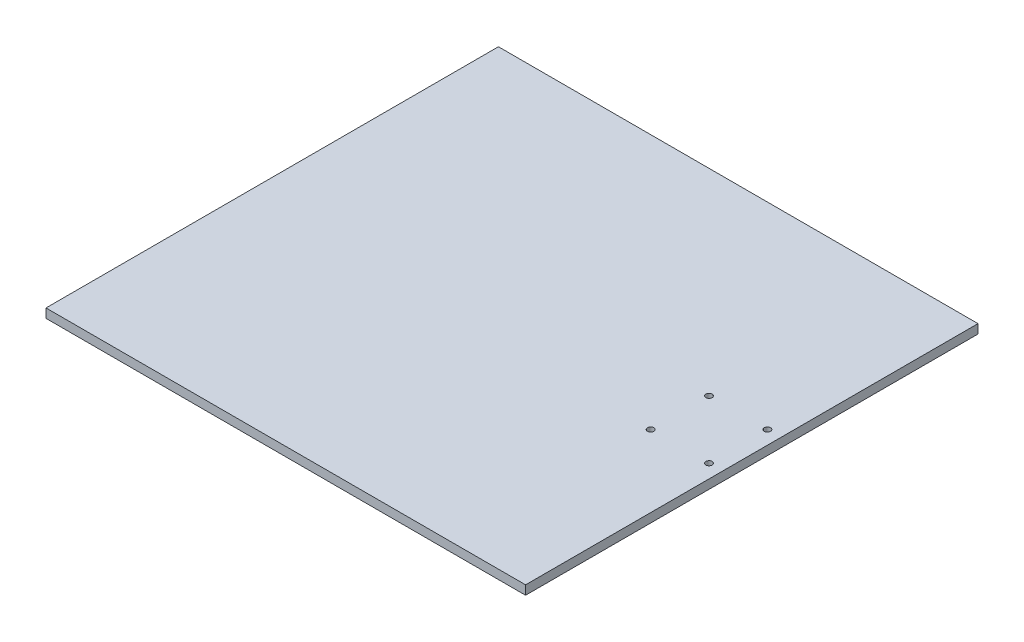
ISO-10303-21;
HEADER;
FILE_DESCRIPTION(('STEP AP214'),'2;1');
FILE_NAME('part.step','',(''),(''),'','','');
FILE_SCHEMA(('AUTOMOTIVE_DESIGN { 1 0 10303 214 1 1 1 1 }'));
ENDSEC;
DATA;
#1=APPLICATION_CONTEXT('core data for automotive mechanical design processes');
#2=APPLICATION_PROTOCOL_DEFINITION('international standard','automotive_design',2000,#1);
#3=PRODUCT_CONTEXT('',#1,'mechanical');
#4=PRODUCT('Part','Part','',(#3));
#5=PRODUCT_RELATED_PRODUCT_CATEGORY('part','',(#4));
#6=PRODUCT_DEFINITION_FORMATION('','',#4);
#7=PRODUCT_DEFINITION_CONTEXT('part definition',#1,'design');
#8=PRODUCT_DEFINITION('design','',#6,#7);
#9=PRODUCT_DEFINITION_SHAPE('','',#8);
#10=(LENGTH_UNIT() NAMED_UNIT(*) SI_UNIT(.MILLI.,.METRE.));
#11=(NAMED_UNIT(*) PLANE_ANGLE_UNIT() SI_UNIT($,.RADIAN.));
#12=(NAMED_UNIT(*) SI_UNIT($,.STERADIAN.) SOLID_ANGLE_UNIT());
#13=UNCERTAINTY_MEASURE_WITH_UNIT(LENGTH_MEASURE(1.E-05),#10,'distance_accuracy_value','');
#14=(GEOMETRIC_REPRESENTATION_CONTEXT(3) GLOBAL_UNCERTAINTY_ASSIGNED_CONTEXT((#13)) GLOBAL_UNIT_ASSIGNED_CONTEXT((#10,
#11,#12)) REPRESENTATION_CONTEXT('',''));
#15=CARTESIAN_POINT('',(0.,0.,0.));
#16=DIRECTION('',(0.,0.,1.));
#17=DIRECTION('',(1.,0.,0.));
#18=AXIS2_PLACEMENT_3D('',#15,#16,#17);
#19=CARTESIAN_POINT('',(265.,10.,250.));
#20=DIRECTION('',(-1.,0.,0.));
#21=DIRECTION('',(0.,0.,1.));
#22=AXIS2_PLACEMENT_3D('',#19,#20,#21);
#23=PLANE('',#22);
#24=DIRECTION('',(0.,0.,-1.));
#25=VECTOR('',#24,1.);
#26=CARTESIAN_POINT('',(265.,0.,250.));
#27=LINE('',#26,#25);
#28=CARTESIAN_POINT('',(265.,0.,250.));
#29=VERTEX_POINT('',#28);
#30=CARTESIAN_POINT('',(265.,0.,-250.));
#31=VERTEX_POINT('',#30);
#32=EDGE_CURVE('E96',#29,#31,#27,.T.);
#33=ORIENTED_EDGE('',*,*,#32,.T.);
#34=DIRECTION('',(0.,-1.,0.));
#35=VECTOR('',#34,1.);
#36=CARTESIAN_POINT('',(265.,10.,-250.));
#37=LINE('',#36,#35);
#38=CARTESIAN_POINT('',(265.,10.,-250.));
#39=VERTEX_POINT('',#38);
#40=EDGE_CURVE('E11',#39,#31,#37,.T.);
#41=ORIENTED_EDGE('',*,*,#40,.F.);
#42=DIRECTION('',(0.,0.,-1.));
#43=VECTOR('',#42,1.);
#44=CARTESIAN_POINT('',(265.,10.,250.));
#45=LINE('',#44,#43);
#46=CARTESIAN_POINT('',(265.,10.,250.));
#47=VERTEX_POINT('',#46);
#48=EDGE_CURVE('E84',#47,#39,#45,.T.);
#49=ORIENTED_EDGE('',*,*,#48,.F.);
#50=DIRECTION('',(0.,-1.,0.));
#51=VECTOR('',#50,1.);
#52=CARTESIAN_POINT('',(265.,10.,250.));
#53=LINE('',#52,#51);
#54=EDGE_CURVE('E92',#47,#29,#53,.T.);
#55=ORIENTED_EDGE('',*,*,#54,.T.);
#56=EDGE_LOOP('',(#33,#41,#49,#55));
#57=FACE_BOUND('',#56,.T.);
#58=ADVANCED_FACE('F33',(#57),#23,.F.);
#59=CARTESIAN_POINT('',(-265.,10.,-250.));
#60=DIRECTION('',(0.,0.,1.));
#61=DIRECTION('',(1.,0.,0.));
#62=AXIS2_PLACEMENT_3D('',#59,#60,#61);
#63=PLANE('',#62);
#64=DIRECTION('',(-1.,0.,0.));
#65=VECTOR('',#64,1.);
#66=CARTESIAN_POINT('',(-265.,0.,-250.));
#67=LINE('',#66,#65);
#68=CARTESIAN_POINT('',(-265.,0.,-250.));
#69=VERTEX_POINT('',#68);
#70=EDGE_CURVE('E88',#31,#69,#67,.T.);
#71=ORIENTED_EDGE('',*,*,#70,.T.);
#72=DIRECTION('',(0.,-1.,0.));
#73=VECTOR('',#72,1.);
#74=CARTESIAN_POINT('',(-265.,10.,-250.));
#75=LINE('',#74,#73);
#76=CARTESIAN_POINT('',(-265.,10.,-250.));
#77=VERTEX_POINT('',#76);
#78=EDGE_CURVE('E41',#77,#69,#75,.T.);
#79=ORIENTED_EDGE('',*,*,#78,.F.);
#80=DIRECTION('',(-1.,0.,0.));
#81=VECTOR('',#80,1.);
#82=CARTESIAN_POINT('',(-265.,10.,-250.));
#83=LINE('',#82,#81);
#84=EDGE_CURVE('E79',#39,#77,#83,.T.);
#85=ORIENTED_EDGE('',*,*,#84,.F.);
#86=ORIENTED_EDGE('',*,*,#40,.T.);
#87=EDGE_LOOP('',(#71,#79,#85,#86));
#88=FACE_BOUND('',#87,.T.);
#89=ADVANCED_FACE('F87',(#88),#63,.F.);
#90=CARTESIAN_POINT('',(-265.,10.,250.));
#91=DIRECTION('',(1.,0.,0.));
#92=DIRECTION('',(0.,0.,-1.));
#93=AXIS2_PLACEMENT_3D('',#90,#91,#92);
#94=PLANE('',#93);
#95=DIRECTION('',(0.,0.,1.));
#96=VECTOR('',#95,1.);
#97=CARTESIAN_POINT('',(-265.,0.,250.));
#98=LINE('',#97,#96);
#99=CARTESIAN_POINT('',(-265.,0.,250.));
#100=VERTEX_POINT('',#99);
#101=EDGE_CURVE('E66',#69,#100,#98,.T.);
#102=ORIENTED_EDGE('',*,*,#101,.T.);
#103=DIRECTION('',(0.,-1.,0.));
#104=VECTOR('',#103,1.);
#105=CARTESIAN_POINT('',(-265.,10.,250.));
#106=LINE('',#105,#104);
#107=CARTESIAN_POINT('',(-265.,10.,250.));
#108=VERTEX_POINT('',#107);
#109=EDGE_CURVE('E89',#108,#100,#106,.T.);
#110=ORIENTED_EDGE('',*,*,#109,.F.);
#111=DIRECTION('',(0.,0.,1.));
#112=VECTOR('',#111,1.);
#113=CARTESIAN_POINT('',(-265.,10.,250.));
#114=LINE('',#113,#112);
#115=EDGE_CURVE('E82',#77,#108,#114,.T.);
#116=ORIENTED_EDGE('',*,*,#115,.F.);
#117=ORIENTED_EDGE('',*,*,#78,.T.);
#118=EDGE_LOOP('',(#102,#110,#116,#117));
#119=FACE_BOUND('',#118,.T.);
#120=ADVANCED_FACE('F90',(#119),#94,.F.);
#121=CARTESIAN_POINT('',(-265.,10.,250.));
#122=DIRECTION('',(0.,0.,-1.));
#123=DIRECTION('',(-1.,0.,0.));
#124=AXIS2_PLACEMENT_3D('',#121,#122,#123);
#125=PLANE('',#124);
#126=DIRECTION('',(1.,0.,0.));
#127=VECTOR('',#126,1.);
#128=CARTESIAN_POINT('',(-265.,0.,250.));
#129=LINE('',#128,#127);
#130=EDGE_CURVE('E72',#100,#29,#129,.T.);
#131=ORIENTED_EDGE('',*,*,#130,.T.);
#132=ORIENTED_EDGE('',*,*,#54,.F.);
#133=DIRECTION('',(1.,0.,0.));
#134=VECTOR('',#133,1.);
#135=CARTESIAN_POINT('',(-265.,10.,250.));
#136=LINE('',#135,#134);
#137=EDGE_CURVE('E49',#108,#47,#136,.T.);
#138=ORIENTED_EDGE('',*,*,#137,.F.);
#139=ORIENTED_EDGE('',*,*,#109,.T.);
#140=EDGE_LOOP('',(#131,#132,#138,#139));
#141=FACE_BOUND('',#140,.T.);
#142=ADVANCED_FACE('F104',(#141),#125,.F.);
#143=CARTESIAN_POINT('',(0.,10.,0.));
#144=DIRECTION('',(0.,-1.,0.));
#145=DIRECTION('',(0.,0.,-1.));
#146=AXIS2_PLACEMENT_3D('',#143,#144,#145);
#147=PLANE('',#146);
#148=CARTESIAN_POINT('',(185.5,10.,32.25));
#149=DIRECTION('',(0.,1.,0.));
#150=DIRECTION('',(0.,0.,1.));
#151=AXIS2_PLACEMENT_3D('',#148,#149,#150);
#152=CIRCLE('',#151,3.49999999999999);
#153=CARTESIAN_POINT('',(185.5,10.,35.75));
#154=VERTEX_POINT('',#153);
#155=EDGE_CURVE('E128',#154,#154,#152,.T.);
#156=ORIENTED_EDGE('',*,*,#155,.F.);
#157=EDGE_LOOP('',(#156));
#158=FACE_BOUND('',#157,.T.);
#159=CARTESIAN_POINT('',(185.5,10.,-32.25));
#160=DIRECTION('',(0.,1.,0.));
#161=DIRECTION('',(0.,0.,1.));
#162=AXIS2_PLACEMENT_3D('',#159,#160,#161);
#163=CIRCLE('',#162,3.49999999999999);
#164=CARTESIAN_POINT('',(185.5,10.,-28.75));
#165=VERTEX_POINT('',#164);
#166=EDGE_CURVE('E122',#165,#165,#163,.T.);
#167=ORIENTED_EDGE('',*,*,#166,.F.);
#168=EDGE_LOOP('',(#167));
#169=FACE_BOUND('',#168,.T.);
#170=CARTESIAN_POINT('',(250.,10.,-32.25));
#171=DIRECTION('',(0.,1.,0.));
#172=DIRECTION('',(0.,0.,1.));
#173=AXIS2_PLACEMENT_3D('',#170,#171,#172);
#174=CIRCLE('',#173,3.50000000000002);
#175=CARTESIAN_POINT('',(250.,10.,-28.75));
#176=VERTEX_POINT('',#175);
#177=EDGE_CURVE('E116',#176,#176,#174,.T.);
#178=ORIENTED_EDGE('',*,*,#177,.F.);
#179=EDGE_LOOP('',(#178));
#180=FACE_BOUND('',#179,.T.);
#181=CARTESIAN_POINT('',(250.,10.,32.25));
#182=DIRECTION('',(0.,1.,0.));
#183=DIRECTION('',(0.,0.,1.));
#184=AXIS2_PLACEMENT_3D('',#181,#182,#183);
#185=CIRCLE('',#184,3.50000000000002);
#186=CARTESIAN_POINT('',(250.,10.,35.75));
#187=VERTEX_POINT('',#186);
#188=EDGE_CURVE('E110',#187,#187,#185,.T.);
#189=ORIENTED_EDGE('',*,*,#188,.F.);
#190=EDGE_LOOP('',(#189));
#191=FACE_BOUND('',#190,.T.);
#192=ORIENTED_EDGE('',*,*,#48,.T.);
#193=ORIENTED_EDGE('',*,*,#84,.T.);
#194=ORIENTED_EDGE('',*,*,#115,.T.);
#195=ORIENTED_EDGE('',*,*,#137,.T.);
#196=EDGE_LOOP('',(#192,#193,#194,#195));
#197=FACE_BOUND('',#196,.T.);
#198=ADVANCED_FACE('F80',(#158,#169,#180,#191,#197),#147,.F.);
#199=CARTESIAN_POINT('',(0.,0.,0.));
#200=DIRECTION('',(0.,-1.,0.));
#201=DIRECTION('',(0.,0.,-1.));
#202=AXIS2_PLACEMENT_3D('',#199,#200,#201);
#203=PLANE('',#202);
#204=CARTESIAN_POINT('',(185.5,0.,32.25));
#205=DIRECTION('',(0.,1.,0.));
#206=DIRECTION('',(0.,0.,1.));
#207=AXIS2_PLACEMENT_3D('',#204,#205,#206);
#208=CIRCLE('',#207,3.49999999999999);
#209=CARTESIAN_POINT('',(185.5,0.,35.75));
#210=VERTEX_POINT('',#209);
#211=EDGE_CURVE('E125',#210,#210,#208,.T.);
#212=ORIENTED_EDGE('',*,*,#211,.T.);
#213=EDGE_LOOP('',(#212));
#214=FACE_BOUND('',#213,.T.);
#215=CARTESIAN_POINT('',(185.5,0.,-32.25));
#216=DIRECTION('',(0.,1.,0.));
#217=DIRECTION('',(0.,0.,1.));
#218=AXIS2_PLACEMENT_3D('',#215,#216,#217);
#219=CIRCLE('',#218,3.49999999999999);
#220=CARTESIAN_POINT('',(185.5,0.,-28.75));
#221=VERTEX_POINT('',#220);
#222=EDGE_CURVE('E119',#221,#221,#219,.T.);
#223=ORIENTED_EDGE('',*,*,#222,.T.);
#224=EDGE_LOOP('',(#223));
#225=FACE_BOUND('',#224,.T.);
#226=CARTESIAN_POINT('',(250.,0.,-32.25));
#227=DIRECTION('',(0.,1.,0.));
#228=DIRECTION('',(0.,0.,1.));
#229=AXIS2_PLACEMENT_3D('',#226,#227,#228);
#230=CIRCLE('',#229,3.50000000000002);
#231=CARTESIAN_POINT('',(250.,0.,-28.75));
#232=VERTEX_POINT('',#231);
#233=EDGE_CURVE('E113',#232,#232,#230,.T.);
#234=ORIENTED_EDGE('',*,*,#233,.T.);
#235=EDGE_LOOP('',(#234));
#236=FACE_BOUND('',#235,.T.);
#237=CARTESIAN_POINT('',(250.,0.,32.25));
#238=DIRECTION('',(0.,1.,0.));
#239=DIRECTION('',(0.,0.,1.));
#240=AXIS2_PLACEMENT_3D('',#237,#238,#239);
#241=CIRCLE('',#240,3.50000000000002);
#242=CARTESIAN_POINT('',(250.,0.,35.75));
#243=VERTEX_POINT('',#242);
#244=EDGE_CURVE('E99',#243,#243,#241,.T.);
#245=ORIENTED_EDGE('',*,*,#244,.T.);
#246=EDGE_LOOP('',(#245));
#247=FACE_BOUND('',#246,.T.);
#248=ORIENTED_EDGE('',*,*,#32,.F.);
#249=ORIENTED_EDGE('',*,*,#130,.F.);
#250=ORIENTED_EDGE('',*,*,#101,.F.);
#251=ORIENTED_EDGE('',*,*,#70,.F.);
#252=EDGE_LOOP('',(#248,#249,#250,#251));
#253=FACE_BOUND('',#252,.T.);
#254=ADVANCED_FACE('F107',(#214,#225,#236,#247,#253),#203,.T.);
#255=CARTESIAN_POINT('',(250.,0.,32.25));
#256=DIRECTION('',(0.,1.,0.));
#257=DIRECTION('',(0.,0.,1.));
#258=AXIS2_PLACEMENT_3D('',#255,#256,#257);
#259=CYLINDRICAL_SURFACE('',#258,3.50000000000002);
#260=ORIENTED_EDGE('',*,*,#244,.F.);
#261=EDGE_LOOP('',(#260));
#262=FACE_BOUND('',#261,.T.);
#263=ORIENTED_EDGE('',*,*,#188,.T.);
#264=EDGE_LOOP('',(#263));
#265=FACE_BOUND('',#264,.T.);
#266=ADVANCED_FACE('F152',(#262,#265),#259,.F.);
#267=CARTESIAN_POINT('',(250.,0.,-32.25));
#268=DIRECTION('',(0.,1.,0.));
#269=DIRECTION('',(0.,0.,1.));
#270=AXIS2_PLACEMENT_3D('',#267,#268,#269);
#271=CYLINDRICAL_SURFACE('',#270,3.50000000000002);
#272=ORIENTED_EDGE('',*,*,#233,.F.);
#273=EDGE_LOOP('',(#272));
#274=FACE_BOUND('',#273,.T.);
#275=ORIENTED_EDGE('',*,*,#177,.T.);
#276=EDGE_LOOP('',(#275));
#277=FACE_BOUND('',#276,.T.);
#278=ADVANCED_FACE('F154',(#274,#277),#271,.F.);
#279=CARTESIAN_POINT('',(185.5,0.,-32.25));
#280=DIRECTION('',(0.,1.,0.));
#281=DIRECTION('',(0.,0.,1.));
#282=AXIS2_PLACEMENT_3D('',#279,#280,#281);
#283=CYLINDRICAL_SURFACE('',#282,3.49999999999999);
#284=ORIENTED_EDGE('',*,*,#222,.F.);
#285=EDGE_LOOP('',(#284));
#286=FACE_BOUND('',#285,.T.);
#287=ORIENTED_EDGE('',*,*,#166,.T.);
#288=EDGE_LOOP('',(#287));
#289=FACE_BOUND('',#288,.T.);
#290=ADVANCED_FACE('F139',(#286,#289),#283,.F.);
#291=CARTESIAN_POINT('',(185.5,0.,32.25));
#292=DIRECTION('',(0.,1.,0.));
#293=DIRECTION('',(0.,0.,1.));
#294=AXIS2_PLACEMENT_3D('',#291,#292,#293);
#295=CYLINDRICAL_SURFACE('',#294,3.49999999999999);
#296=ORIENTED_EDGE('',*,*,#211,.F.);
#297=EDGE_LOOP('',(#296));
#298=FACE_BOUND('',#297,.T.);
#299=ORIENTED_EDGE('',*,*,#155,.T.);
#300=EDGE_LOOP('',(#299));
#301=FACE_BOUND('',#300,.T.);
#302=ADVANCED_FACE('F136',(#298,#301),#295,.F.);
#303=CLOSED_SHELL('',(#58,#89,#120,#142,#198,#254,#266,#278,#290,#302));
#304=MANIFOLD_SOLID_BREP('B2',#303);
#305=ADVANCED_BREP_SHAPE_REPRESENTATION('',(#18,#304),#14);
#306=SHAPE_DEFINITION_REPRESENTATION(#9,#305);
ENDSEC;
END-ISO-10303-21;
